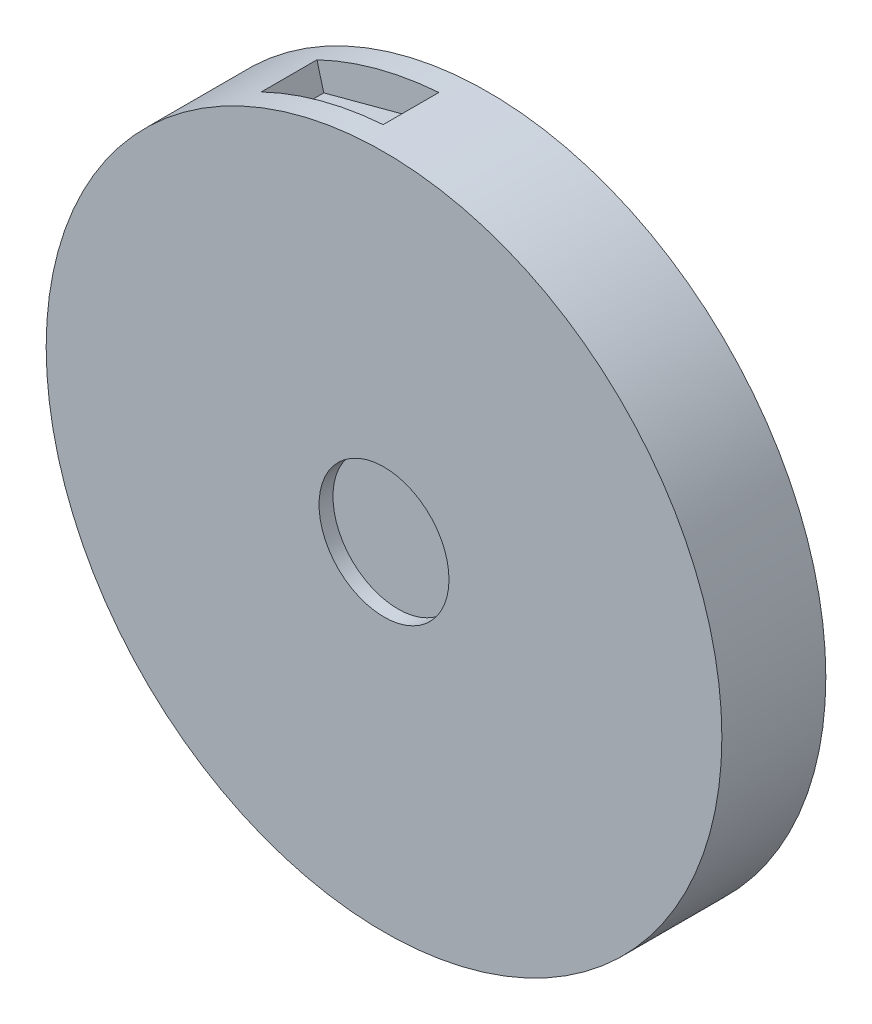
ISO-10303-21;
HEADER;
FILE_DESCRIPTION(('STEP AP214'),'2;1');
FILE_NAME('part.step','',(''),(''),'','','');
FILE_SCHEMA(('AUTOMOTIVE_DESIGN { 1 0 10303 214 1 1 1 1 }'));
ENDSEC;
DATA;
#1=APPLICATION_CONTEXT('core data for automotive mechanical design processes');
#2=APPLICATION_PROTOCOL_DEFINITION('international standard','automotive_design',2000,#1);
#3=PRODUCT_CONTEXT('',#1,'mechanical');
#4=PRODUCT('Part','Part','',(#3));
#5=PRODUCT_RELATED_PRODUCT_CATEGORY('part','',(#4));
#6=PRODUCT_DEFINITION_FORMATION('','',#4);
#7=PRODUCT_DEFINITION_CONTEXT('part definition',#1,'design');
#8=PRODUCT_DEFINITION('design','',#6,#7);
#9=PRODUCT_DEFINITION_SHAPE('','',#8);
#10=(LENGTH_UNIT() NAMED_UNIT(*) SI_UNIT(.MILLI.,.METRE.));
#11=(NAMED_UNIT(*) PLANE_ANGLE_UNIT() SI_UNIT($,.RADIAN.));
#12=(NAMED_UNIT(*) SI_UNIT($,.STERADIAN.) SOLID_ANGLE_UNIT());
#13=UNCERTAINTY_MEASURE_WITH_UNIT(LENGTH_MEASURE(1.E-05),#10,'distance_accuracy_value','');
#14=(GEOMETRIC_REPRESENTATION_CONTEXT(3) GLOBAL_UNCERTAINTY_ASSIGNED_CONTEXT((#13)) GLOBAL_UNIT_ASSIGNED_CONTEXT((#10,
#11,#12)) REPRESENTATION_CONTEXT('',''));
#15=CARTESIAN_POINT('',(0.,0.,0.));
#16=DIRECTION('',(0.,0.,1.));
#17=DIRECTION('',(1.,0.,0.));
#18=AXIS2_PLACEMENT_3D('',#15,#16,#17);
#19=CARTESIAN_POINT('',(0.,0.,5.6));
#20=DIRECTION('',(0.,0.,-1.));
#21=DIRECTION('',(-1.,0.,0.));
#22=AXIS2_PLACEMENT_3D('',#19,#20,#21);
#23=CYLINDRICAL_SURFACE('',#22,18.2);
#24=CARTESIAN_POINT('',(0.,0.,0.));
#25=DIRECTION('',(0.,0.,1.));
#26=DIRECTION('',(1.,0.,0.));
#27=AXIS2_PLACEMENT_3D('',#24,#25,#26);
#28=CIRCLE('',#27,18.2);
#29=CARTESIAN_POINT('',(18.2,0.,0.));
#30=VERTEX_POINT('',#29);
#31=EDGE_CURVE('E42',#30,#30,#28,.T.);
#32=ORIENTED_EDGE('',*,*,#31,.T.);
#33=EDGE_LOOP('',(#32));
#34=FACE_BOUND('',#33,.T.);
#35=CARTESIAN_POINT('',(0.,0.,5.6));
#36=DIRECTION('',(0.,0.,1.));
#37=DIRECTION('',(1.,0.,0.));
#38=AXIS2_PLACEMENT_3D('',#35,#36,#37);
#39=CIRCLE('',#38,18.2);
#40=CARTESIAN_POINT('',(18.2,0.,5.6));
#41=VERTEX_POINT('',#40);
#42=EDGE_CURVE('E11',#41,#41,#39,.T.);
#43=ORIENTED_EDGE('',*,*,#42,.F.);
#44=EDGE_LOOP('',(#43));
#45=FACE_BOUND('',#44,.T.);
#46=CARTESIAN_POINT('',(0.,0.,4.3));
#47=DIRECTION('',(0.,0.,-1.));
#48=DIRECTION('',(-1.,0.,0.));
#49=AXIS2_PLACEMENT_3D('',#46,#47,#48);
#50=CIRCLE('',#49,18.2);
#51=CARTESIAN_POINT('',(-1.34343249344233,18.150349559597,4.3));
#52=VERTEX_POINT('',#51);
#53=CARTESIAN_POINT('',(-7.91172811220799,16.3903800528999,4.3));
#54=VERTEX_POINT('',#53);
#55=EDGE_CURVE('E164',#52,#54,#50,.F.);
#56=ORIENTED_EDGE('',*,*,#55,.T.);
#57=DIRECTION('',(0.,0.,-1.));
#58=VECTOR('',#57,1.);
#59=CARTESIAN_POINT('',(-7.91172811220799,16.3903800528999,5.6));
#60=LINE('',#59,#58);
#61=CARTESIAN_POINT('',(-7.91172811220799,16.3903800528999,1.3));
#62=VERTEX_POINT('',#61);
#63=EDGE_CURVE('E150',#54,#62,#60,.T.);
#64=ORIENTED_EDGE('',*,*,#63,.T.);
#65=CARTESIAN_POINT('',(0.,0.,1.3));
#66=DIRECTION('',(0.,0.,1.));
#67=DIRECTION('',(1.,0.,0.));
#68=AXIS2_PLACEMENT_3D('',#65,#66,#67);
#69=CIRCLE('',#68,18.2);
#70=CARTESIAN_POINT('',(-1.34343249344233,18.150349559597,1.3));
#71=VERTEX_POINT('',#70);
#72=EDGE_CURVE('E175',#62,#71,#69,.F.);
#73=ORIENTED_EDGE('',*,*,#72,.T.);
#74=DIRECTION('',(0.,0.,-1.));
#75=VECTOR('',#74,1.);
#76=CARTESIAN_POINT('',(-1.34343249344233,18.150349559597,5.6));
#77=LINE('',#76,#75);
#78=EDGE_CURVE('E171',#71,#52,#77,.F.);
#79=ORIENTED_EDGE('',*,*,#78,.T.);
#80=EDGE_LOOP('',(#56,#64,#73,#79));
#81=FACE_BOUND('',#80,.T.);
#82=ADVANCED_FACE('F39',(#34,#45,#81),#23,.T.);
#83=CARTESIAN_POINT('',(0.,0.,0.));
#84=DIRECTION('',(0.,0.,1.));
#85=DIRECTION('',(1.,0.,0.));
#86=AXIS2_PLACEMENT_3D('',#83,#84,#85);
#87=PLANE('',#86);
#88=CARTESIAN_POINT('',(-13.7080078236947,-11.3000096261424,0.));
#89=DIRECTION('',(0.,0.,-1.));
#90=DIRECTION('',(1.,0.,0.));
#91=AXIS2_PLACEMENT_3D('',#88,#89,#90);
#92=CIRCLE('',#91,0.749999999999999);
#93=CARTESIAN_POINT('',(-13.8232715037505,-10.5589196963363,0.));
#94=VERTEX_POINT('',#93);
#95=CARTESIAN_POINT('',(-13.0025271502126,-11.5545622127394,0.));
#96=VERTEX_POINT('',#95);
#97=EDGE_CURVE('E211',#94,#96,#92,.T.);
#98=ORIENTED_EDGE('',*,*,#97,.F.);
#99=CARTESIAN_POINT('',(-13.8540084850988,-10.3612957150547,0.));
#100=DIRECTION('',(0.,0.,1.));
#101=DIRECTION('',(-1.,0.,0.));
#102=AXIS2_PLACEMENT_3D('',#99,#100,#101);
#103=CIRCLE('',#102,0.2);
#104=CARTESIAN_POINT('',(-14.0141704329034,-10.4810794805467,0.));
#105=VERTEX_POINT('',#104);
#106=EDGE_CURVE('E62',#105,#94,#103,.T.);
#107=ORIENTED_EDGE('',*,*,#106,.F.);
#108=CARTESIAN_POINT('',(0.,0.,0.));
#109=DIRECTION('',(0.,0.,-1.));
#110=DIRECTION('',(-1.,0.,0.));
#111=AXIS2_PLACEMENT_3D('',#108,#109,#110);
#112=CIRCLE('',#111,17.5);
#113=CARTESIAN_POINT('',(-12.9625423113181,-11.7568064042616,0.));
#114=VERTEX_POINT('',#113);
#115=EDGE_CURVE('E200',#114,#105,#112,.T.);
#116=ORIENTED_EDGE('',*,*,#115,.F.);
#117=CARTESIAN_POINT('',(-12.8143989706174,-11.6224429024986,0.));
#118=DIRECTION('',(0.,0.,1.));
#119=DIRECTION('',(1.,0.,0.));
#120=AXIS2_PLACEMENT_3D('',#117,#118,#119);
#121=CIRCLE('',#120,0.199999999999999);
#122=EDGE_CURVE('E214',#96,#114,#121,.T.);
#123=ORIENTED_EDGE('',*,*,#122,.F.);
#124=EDGE_LOOP('',(#98,#107,#116,#123));
#125=FACE_BOUND('',#124,.T.);
#126=CARTESIAN_POINT('',(11.4493785932638,-13.8892068702141,0.));
#127=DIRECTION('',(0.,0.,-1.));
#128=DIRECTION('',(1.,0.,0.));
#129=AXIS2_PLACEMENT_3D('',#126,#127,#128);
#130=CIRCLE('',#129,2.);
#131=CARTESIAN_POINT('',(9.5429332328363,-14.4937447827593,0.));
#132=VERTEX_POINT('',#131);
#133=CARTESIAN_POINT('',(12.4065763656063,-12.1331395524206,0.));
#134=VERTEX_POINT('',#133);
#135=EDGE_CURVE('E274',#132,#134,#130,.T.);
#136=ORIENTED_EDGE('',*,*,#135,.F.);
#137=CARTESIAN_POINT('',(9.35228869679355,-14.5541985740139,0.));
#138=DIRECTION('',(0.,0.,1.));
#139=DIRECTION('',(-1.,0.,0.));
#140=AXIS2_PLACEMENT_3D('',#137,#138,#139);
#141=CIRCLE('',#140,0.199999999999996);
#142=CARTESIAN_POINT('',(9.46040764126515,-14.7224552049273,0.));
#143=VERTEX_POINT('',#142);
#144=EDGE_CURVE('E252',#143,#132,#141,.T.);
#145=ORIENTED_EDGE('',*,*,#144,.F.);
#146=CARTESIAN_POINT('',(0.,0.,0.));
#147=DIRECTION('',(0.,0.,-1.));
#148=DIRECTION('',(-1.,0.,0.));
#149=AXIS2_PLACEMENT_3D('',#146,#147,#148);
#150=CIRCLE('',#149,17.5);
#151=CARTESIAN_POINT('',(12.6468313583647,-12.0957701942903,0.));
#152=VERTEX_POINT('',#151);
#153=EDGE_CURVE('E263',#152,#143,#150,.T.);
#154=ORIENTED_EDGE('',*,*,#153,.F.);
#155=CARTESIAN_POINT('',(12.5022961428406,-11.9575328206413,0.));
#156=DIRECTION('',(0.,0.,1.));
#157=DIRECTION('',(1.,0.,0.));
#158=AXIS2_PLACEMENT_3D('',#155,#156,#157);
#159=CIRCLE('',#158,0.199999999999996);
#160=EDGE_CURVE('E277',#134,#152,#159,.T.);
#161=ORIENTED_EDGE('',*,*,#160,.F.);
#162=EDGE_LOOP('',(#136,#145,#154,#161));
#163=FACE_BOUND('',#162,.T.);
#164=ORIENTED_EDGE('',*,*,#31,.F.);
#165=EDGE_LOOP('',(#164));
#166=FACE_BOUND('',#165,.T.);
#167=CARTESIAN_POINT('',(-12.5022961428406,11.9575328206413,0.));
#168=DIRECTION('',(0.,0.,1.));
#169=DIRECTION('',(1.,0.,0.));
#170=AXIS2_PLACEMENT_3D('',#167,#168,#169);
#171=CIRCLE('',#170,0.199999999999996);
#172=CARTESIAN_POINT('',(-12.4065763656063,12.1331395524206,0.));
#173=VERTEX_POINT('',#172);
#174=CARTESIAN_POINT('',(-12.6468313583648,12.0957701942903,0.));
#175=VERTEX_POINT('',#174);
#176=EDGE_CURVE('E242',#173,#175,#171,.T.);
#177=ORIENTED_EDGE('',*,*,#176,.F.);
#178=CARTESIAN_POINT('',(-11.4493785932638,13.8892068702141,0.));
#179=DIRECTION('',(0.,0.,-1.));
#180=DIRECTION('',(-1.,0.,0.));
#181=AXIS2_PLACEMENT_3D('',#178,#179,#180);
#182=CIRCLE('',#181,2.);
#183=CARTESIAN_POINT('',(-9.5429332328363,14.4937447827593,0.));
#184=VERTEX_POINT('',#183);
#185=EDGE_CURVE('E221',#184,#173,#182,.T.);
#186=ORIENTED_EDGE('',*,*,#185,.F.);
#187=CARTESIAN_POINT('',(-9.35228869679356,14.5541985740139,0.));
#188=DIRECTION('',(0.,0.,1.));
#189=DIRECTION('',(-1.,0.,0.));
#190=AXIS2_PLACEMENT_3D('',#187,#188,#189);
#191=CIRCLE('',#190,0.199999999999994);
#192=CARTESIAN_POINT('',(-9.46040764126515,14.7224552049273,0.));
#193=VERTEX_POINT('',#192);
#194=EDGE_CURVE('E231',#193,#184,#191,.T.);
#195=ORIENTED_EDGE('',*,*,#194,.F.);
#196=CARTESIAN_POINT('',(0.,0.,0.));
#197=DIRECTION('',(0.,0.,-1.));
#198=DIRECTION('',(-1.,0.,0.));
#199=AXIS2_PLACEMENT_3D('',#196,#197,#198);
#200=CIRCLE('',#199,17.5);
#201=EDGE_CURVE('E245',#175,#193,#200,.T.);
#202=ORIENTED_EDGE('',*,*,#201,.F.);
#203=EDGE_LOOP('',(#177,#186,#195,#202));
#204=FACE_BOUND('',#203,.T.);
#205=ADVANCED_FACE('F298',(#125,#163,#166,#204),#87,.F.);
#206=CARTESIAN_POINT('',(0.,0.,5.6));
#207=DIRECTION('',(0.,0.,1.));
#208=DIRECTION('',(1.,0.,0.));
#209=AXIS2_PLACEMENT_3D('',#206,#207,#208);
#210=PLANE('',#209);
#211=CARTESIAN_POINT('',(0.,0.,5.6));
#212=DIRECTION('',(0.,0.,1.));
#213=DIRECTION('',(1.,0.,0.));
#214=AXIS2_PLACEMENT_3D('',#211,#212,#213);
#215=CIRCLE('',#214,3.5);
#216=CARTESIAN_POINT('',(3.5,0.,5.6));
#217=VERTEX_POINT('',#216);
#218=EDGE_CURVE('E158',#217,#217,#215,.T.);
#219=ORIENTED_EDGE('',*,*,#218,.F.);
#220=EDGE_LOOP('',(#219));
#221=FACE_BOUND('',#220,.T.);
#222=ORIENTED_EDGE('',*,*,#42,.T.);
#223=EDGE_LOOP('',(#222));
#224=FACE_BOUND('',#223,.T.);
#225=ADVANCED_FACE('F317',(#221,#224),#210,.T.);
#226=CARTESIAN_POINT('',(9.35228869679355,-14.5541985740139,4.));
#227=DIRECTION('',(0.,0.,-1.));
#228=DIRECTION('',(-1.,0.,0.));
#229=AXIS2_PLACEMENT_3D('',#226,#227,#228);
#230=CYLINDRICAL_SURFACE('',#229,0.199999999999996);
#231=ORIENTED_EDGE('',*,*,#144,.T.);
#232=DIRECTION('',(0.,0.,-1.));
#233=VECTOR('',#232,1.);
#234=CARTESIAN_POINT('',(9.5429332328363,-14.4937447827593,4.));
#235=LINE('',#234,#233);
#236=CARTESIAN_POINT('',(9.5429332328363,-14.4937447827593,4.));
#237=VERTEX_POINT('',#236);
#238=EDGE_CURVE('E272',#237,#132,#235,.T.);
#239=ORIENTED_EDGE('',*,*,#238,.F.);
#240=CARTESIAN_POINT('',(9.35228869679355,-14.5541985740139,4.));
#241=DIRECTION('',(0.,0.,1.));
#242=DIRECTION('',(-1.,0.,0.));
#243=AXIS2_PLACEMENT_3D('',#240,#241,#242);
#244=CIRCLE('',#243,0.199999999999996);
#245=CARTESIAN_POINT('',(9.46040764126515,-14.7224552049273,4.));
#246=VERTEX_POINT('',#245);
#247=EDGE_CURVE('E259',#246,#237,#244,.T.);
#248=ORIENTED_EDGE('',*,*,#247,.F.);
#249=DIRECTION('',(0.,0.,-1.));
#250=VECTOR('',#249,1.);
#251=CARTESIAN_POINT('',(9.46040764126515,-14.7224552049273,4.));
#252=LINE('',#251,#250);
#253=EDGE_CURVE('E282',#246,#143,#252,.T.);
#254=ORIENTED_EDGE('',*,*,#253,.T.);
#255=EDGE_LOOP('',(#231,#239,#248,#254));
#256=FACE_BOUND('',#255,.T.);
#257=ADVANCED_FACE('F307',(#256),#230,.T.);
#258=CARTESIAN_POINT('',(0.,0.,4.));
#259=DIRECTION('',(0.,0.,-1.));
#260=DIRECTION('',(-1.,0.,0.));
#261=AXIS2_PLACEMENT_3D('',#258,#259,#260);
#262=CYLINDRICAL_SURFACE('',#261,17.5);
#263=ORIENTED_EDGE('',*,*,#153,.T.);
#264=ORIENTED_EDGE('',*,*,#253,.F.);
#265=CARTESIAN_POINT('',(0.,0.,4.));
#266=DIRECTION('',(0.,0.,-1.));
#267=DIRECTION('',(-1.,0.,0.));
#268=AXIS2_PLACEMENT_3D('',#265,#266,#267);
#269=CIRCLE('',#268,17.5);
#270=CARTESIAN_POINT('',(12.6468313583647,-12.0957701942903,4.));
#271=VERTEX_POINT('',#270);
#272=EDGE_CURVE('E269',#271,#246,#269,.T.);
#273=ORIENTED_EDGE('',*,*,#272,.F.);
#274=DIRECTION('',(0.,0.,-1.));
#275=VECTOR('',#274,1.);
#276=CARTESIAN_POINT('',(12.6468313583647,-12.0957701942903,4.));
#277=LINE('',#276,#275);
#278=EDGE_CURVE('E284',#271,#152,#277,.T.);
#279=ORIENTED_EDGE('',*,*,#278,.T.);
#280=EDGE_LOOP('',(#263,#264,#273,#279));
#281=FACE_BOUND('',#280,.T.);
#282=ADVANCED_FACE('F309',(#281),#262,.F.);
#283=CARTESIAN_POINT('',(12.5022961428406,-11.9575328206413,4.));
#284=DIRECTION('',(0.,0.,-1.));
#285=DIRECTION('',(-1.,0.,0.));
#286=AXIS2_PLACEMENT_3D('',#283,#284,#285);
#287=CYLINDRICAL_SURFACE('',#286,0.199999999999996);
#288=ORIENTED_EDGE('',*,*,#160,.T.);
#289=ORIENTED_EDGE('',*,*,#278,.F.);
#290=CARTESIAN_POINT('',(12.5022961428406,-11.9575328206413,4.));
#291=DIRECTION('',(0.,0.,1.));
#292=DIRECTION('',(1.,0.,0.));
#293=AXIS2_PLACEMENT_3D('',#290,#291,#292);
#294=CIRCLE('',#293,0.199999999999996);
#295=CARTESIAN_POINT('',(12.4065763656063,-12.1331395524206,4.));
#296=VERTEX_POINT('',#295);
#297=EDGE_CURVE('E266',#296,#271,#294,.T.);
#298=ORIENTED_EDGE('',*,*,#297,.F.);
#299=DIRECTION('',(0.,0.,-1.));
#300=VECTOR('',#299,1.);
#301=CARTESIAN_POINT('',(12.4065763656063,-12.1331395524206,4.));
#302=LINE('',#301,#300);
#303=EDGE_CURVE('E286',#296,#134,#302,.T.);
#304=ORIENTED_EDGE('',*,*,#303,.T.);
#305=EDGE_LOOP('',(#288,#289,#298,#304));
#306=FACE_BOUND('',#305,.T.);
#307=ADVANCED_FACE('F302',(#306),#287,.T.);
#308=CARTESIAN_POINT('',(11.4493785932638,-13.8892068702141,4.));
#309=DIRECTION('',(0.,0.,-1.));
#310=DIRECTION('',(-1.,0.,0.));
#311=AXIS2_PLACEMENT_3D('',#308,#309,#310);
#312=CYLINDRICAL_SURFACE('',#311,2.);
#313=ORIENTED_EDGE('',*,*,#135,.T.);
#314=ORIENTED_EDGE('',*,*,#303,.F.);
#315=CARTESIAN_POINT('',(11.4493785932638,-13.8892068702141,4.));
#316=DIRECTION('',(0.,0.,-1.));
#317=DIRECTION('',(1.,0.,0.));
#318=AXIS2_PLACEMENT_3D('',#315,#316,#317);
#319=CIRCLE('',#318,2.);
#320=EDGE_CURVE('E262',#237,#296,#319,.T.);
#321=ORIENTED_EDGE('',*,*,#320,.F.);
#322=ORIENTED_EDGE('',*,*,#238,.T.);
#323=EDGE_LOOP('',(#313,#314,#321,#322));
#324=FACE_BOUND('',#323,.T.);
#325=ADVANCED_FACE('F292',(#324),#312,.F.);
#326=CARTESIAN_POINT('',(4.67614434839678,-7.27709928700693,4.));
#327=DIRECTION('',(0.,0.,-1.));
#328=DIRECTION('',(-1.,0.,0.));
#329=AXIS2_PLACEMENT_3D('',#326,#327,#328);
#330=PLANE('',#329);
#331=ORIENTED_EDGE('',*,*,#247,.T.);
#332=ORIENTED_EDGE('',*,*,#320,.T.);
#333=ORIENTED_EDGE('',*,*,#297,.T.);
#334=ORIENTED_EDGE('',*,*,#272,.T.);
#335=EDGE_LOOP('',(#331,#332,#333,#334));
#336=FACE_BOUND('',#335,.T.);
#337=ADVANCED_FACE('F306',(#336),#330,.T.);
#338=CARTESIAN_POINT('',(-11.4493785932638,13.8892068702141,4.));
#339=DIRECTION('',(0.,0.,-1.));
#340=DIRECTION('',(-1.,0.,0.));
#341=AXIS2_PLACEMENT_3D('',#338,#339,#340);
#342=CYLINDRICAL_SURFACE('',#341,2.);
#343=ORIENTED_EDGE('',*,*,#185,.T.);
#344=DIRECTION('',(0.,0.,-1.));
#345=VECTOR('',#344,1.);
#346=CARTESIAN_POINT('',(-12.4065763656063,12.1331395524206,4.));
#347=LINE('',#346,#345);
#348=CARTESIAN_POINT('',(-12.4065763656063,12.1331395524206,4.));
#349=VERTEX_POINT('',#348);
#350=EDGE_CURVE('E240',#349,#173,#347,.T.);
#351=ORIENTED_EDGE('',*,*,#350,.F.);
#352=CARTESIAN_POINT('',(-11.4493785932638,13.8892068702141,4.));
#353=DIRECTION('',(0.,0.,-1.));
#354=DIRECTION('',(-1.,0.,0.));
#355=AXIS2_PLACEMENT_3D('',#352,#353,#354);
#356=CIRCLE('',#355,2.);
#357=CARTESIAN_POINT('',(-9.5429332328363,14.4937447827593,4.));
#358=VERTEX_POINT('',#357);
#359=EDGE_CURVE('E227',#358,#349,#356,.T.);
#360=ORIENTED_EDGE('',*,*,#359,.F.);
#361=DIRECTION('',(0.,0.,-1.));
#362=VECTOR('',#361,1.);
#363=CARTESIAN_POINT('',(-9.5429332328363,14.4937447827593,4.));
#364=LINE('',#363,#362);
#365=EDGE_CURVE('E250',#358,#184,#364,.T.);
#366=ORIENTED_EDGE('',*,*,#365,.T.);
#367=EDGE_LOOP('',(#343,#351,#360,#366));
#368=FACE_BOUND('',#367,.T.);
#369=ADVANCED_FACE('F342',(#368),#342,.F.);
#370=CARTESIAN_POINT('',(-9.35228869679356,14.5541985740139,4.));
#371=DIRECTION('',(0.,0.,-1.));
#372=DIRECTION('',(-1.,0.,0.));
#373=AXIS2_PLACEMENT_3D('',#370,#371,#372);
#374=CYLINDRICAL_SURFACE('',#373,0.199999999999994);
#375=ORIENTED_EDGE('',*,*,#194,.T.);
#376=ORIENTED_EDGE('',*,*,#365,.F.);
#377=CARTESIAN_POINT('',(-9.35228869679356,14.5541985740139,4.));
#378=DIRECTION('',(0.,0.,1.));
#379=DIRECTION('',(-1.,0.,0.));
#380=AXIS2_PLACEMENT_3D('',#377,#378,#379);
#381=CIRCLE('',#380,0.199999999999994);
#382=CARTESIAN_POINT('',(-9.46040764126515,14.7224552049273,4.));
#383=VERTEX_POINT('',#382);
#384=EDGE_CURVE('E237',#383,#358,#381,.T.);
#385=ORIENTED_EDGE('',*,*,#384,.F.);
#386=DIRECTION('',(0.,0.,-1.));
#387=VECTOR('',#386,1.);
#388=CARTESIAN_POINT('',(-9.46040764126515,14.7224552049273,4.));
#389=LINE('',#388,#387);
#390=EDGE_CURVE('E253',#383,#193,#389,.T.);
#391=ORIENTED_EDGE('',*,*,#390,.T.);
#392=EDGE_LOOP('',(#375,#376,#385,#391));
#393=FACE_BOUND('',#392,.T.);
#394=ADVANCED_FACE('F346',(#393),#374,.T.);
#395=CARTESIAN_POINT('',(0.,0.,4.));
#396=DIRECTION('',(0.,0.,-1.));
#397=DIRECTION('',(-1.,0.,0.));
#398=AXIS2_PLACEMENT_3D('',#395,#396,#397);
#399=CYLINDRICAL_SURFACE('',#398,17.5);
#400=ORIENTED_EDGE('',*,*,#201,.T.);
#401=ORIENTED_EDGE('',*,*,#390,.F.);
#402=CARTESIAN_POINT('',(0.,0.,4.));
#403=DIRECTION('',(0.,0.,-1.));
#404=DIRECTION('',(-1.,0.,0.));
#405=AXIS2_PLACEMENT_3D('',#402,#403,#404);
#406=CIRCLE('',#405,17.5);
#407=CARTESIAN_POINT('',(-12.6468313583648,12.0957701942903,4.));
#408=VERTEX_POINT('',#407);
#409=EDGE_CURVE('E234',#408,#383,#406,.T.);
#410=ORIENTED_EDGE('',*,*,#409,.F.);
#411=DIRECTION('',(0.,0.,-1.));
#412=VECTOR('',#411,1.);
#413=CARTESIAN_POINT('',(-12.6468313583648,12.0957701942903,4.));
#414=LINE('',#413,#412);
#415=EDGE_CURVE('E255',#408,#175,#414,.T.);
#416=ORIENTED_EDGE('',*,*,#415,.T.);
#417=EDGE_LOOP('',(#400,#401,#410,#416));
#418=FACE_BOUND('',#417,.T.);
#419=ADVANCED_FACE('F354',(#418),#399,.F.);
#420=CARTESIAN_POINT('',(-12.5022961428406,11.9575328206413,4.));
#421=DIRECTION('',(0.,0.,-1.));
#422=DIRECTION('',(-1.,0.,0.));
#423=AXIS2_PLACEMENT_3D('',#420,#421,#422);
#424=CYLINDRICAL_SURFACE('',#423,0.199999999999996);
#425=ORIENTED_EDGE('',*,*,#176,.T.);
#426=ORIENTED_EDGE('',*,*,#415,.F.);
#427=CARTESIAN_POINT('',(-12.5022961428406,11.9575328206413,4.));
#428=DIRECTION('',(0.,0.,1.));
#429=DIRECTION('',(1.,0.,0.));
#430=AXIS2_PLACEMENT_3D('',#427,#428,#429);
#431=CIRCLE('',#430,0.199999999999996);
#432=EDGE_CURVE('E230',#349,#408,#431,.T.);
#433=ORIENTED_EDGE('',*,*,#432,.F.);
#434=ORIENTED_EDGE('',*,*,#350,.T.);
#435=EDGE_LOOP('',(#425,#426,#433,#434));
#436=FACE_BOUND('',#435,.T.);
#437=ADVANCED_FACE('F350',(#436),#424,.T.);
#438=CARTESIAN_POINT('',(-11.9758373680522,12.9233698454277,4.));
#439=DIRECTION('',(0.,0.,-1.));
#440=DIRECTION('',(-1.,0.,0.));
#441=AXIS2_PLACEMENT_3D('',#438,#439,#440);
#442=PLANE('',#441);
#443=ORIENTED_EDGE('',*,*,#359,.T.);
#444=ORIENTED_EDGE('',*,*,#432,.T.);
#445=ORIENTED_EDGE('',*,*,#409,.T.);
#446=ORIENTED_EDGE('',*,*,#384,.T.);
#447=EDGE_LOOP('',(#443,#444,#445,#446));
#448=FACE_BOUND('',#447,.T.);
#449=ADVANCED_FACE('F353',(#448),#442,.T.);
#450=CARTESIAN_POINT('',(-13.8540084850988,-10.3612957150547,4.));
#451=DIRECTION('',(0.,0.,-1.));
#452=DIRECTION('',(-1.,0.,0.));
#453=AXIS2_PLACEMENT_3D('',#450,#451,#452);
#454=CYLINDRICAL_SURFACE('',#453,0.2);
#455=ORIENTED_EDGE('',*,*,#106,.T.);
#456=DIRECTION('',(0.,0.,-1.));
#457=VECTOR('',#456,1.);
#458=CARTESIAN_POINT('',(-13.8232715037505,-10.5589196963363,4.));
#459=LINE('',#458,#457);
#460=CARTESIAN_POINT('',(-13.8232715037505,-10.5589196963363,4.));
#461=VERTEX_POINT('',#460);
#462=EDGE_CURVE('E209',#461,#94,#459,.T.);
#463=ORIENTED_EDGE('',*,*,#462,.F.);
#464=CARTESIAN_POINT('',(-13.8540084850988,-10.3612957150547,4.));
#465=DIRECTION('',(0.,0.,1.));
#466=DIRECTION('',(-1.,0.,0.));
#467=AXIS2_PLACEMENT_3D('',#464,#465,#466);
#468=CIRCLE('',#467,0.2);
#469=CARTESIAN_POINT('',(-14.0141704329034,-10.4810794805467,4.));
#470=VERTEX_POINT('',#469);
#471=EDGE_CURVE('E196',#470,#461,#468,.T.);
#472=ORIENTED_EDGE('',*,*,#471,.F.);
#473=DIRECTION('',(0.,0.,-1.));
#474=VECTOR('',#473,1.);
#475=CARTESIAN_POINT('',(-14.0141704329034,-10.4810794805467,4.));
#476=LINE('',#475,#474);
#477=EDGE_CURVE('E219',#470,#105,#476,.T.);
#478=ORIENTED_EDGE('',*,*,#477,.T.);
#479=EDGE_LOOP('',(#455,#463,#472,#478));
#480=FACE_BOUND('',#479,.T.);
#481=ADVANCED_FACE('F364',(#480),#454,.T.);
#482=CARTESIAN_POINT('',(0.,0.,4.));
#483=DIRECTION('',(0.,0.,-1.));
#484=DIRECTION('',(-1.,0.,0.));
#485=AXIS2_PLACEMENT_3D('',#482,#483,#484);
#486=CYLINDRICAL_SURFACE('',#485,17.5);
#487=ORIENTED_EDGE('',*,*,#115,.T.);
#488=ORIENTED_EDGE('',*,*,#477,.F.);
#489=CARTESIAN_POINT('',(0.,0.,4.));
#490=DIRECTION('',(0.,0.,-1.));
#491=DIRECTION('',(-1.,0.,0.));
#492=AXIS2_PLACEMENT_3D('',#489,#490,#491);
#493=CIRCLE('',#492,17.5);
#494=CARTESIAN_POINT('',(-12.9625423113181,-11.7568064042616,4.));
#495=VERTEX_POINT('',#494);
#496=EDGE_CURVE('E206',#495,#470,#493,.T.);
#497=ORIENTED_EDGE('',*,*,#496,.F.);
#498=DIRECTION('',(0.,0.,-1.));
#499=VECTOR('',#498,1.);
#500=CARTESIAN_POINT('',(-12.9625423113181,-11.7568064042616,4.));
#501=LINE('',#500,#499);
#502=EDGE_CURVE('E222',#495,#114,#501,.T.);
#503=ORIENTED_EDGE('',*,*,#502,.T.);
#504=EDGE_LOOP('',(#487,#488,#497,#503));
#505=FACE_BOUND('',#504,.T.);
#506=ADVANCED_FACE('F368',(#505),#486,.F.);
#507=CARTESIAN_POINT('',(-12.8143989706174,-11.6224429024986,4.));
#508=DIRECTION('',(0.,0.,-1.));
#509=DIRECTION('',(-1.,0.,0.));
#510=AXIS2_PLACEMENT_3D('',#507,#508,#509);
#511=CYLINDRICAL_SURFACE('',#510,0.199999999999999);
#512=ORIENTED_EDGE('',*,*,#122,.T.);
#513=ORIENTED_EDGE('',*,*,#502,.F.);
#514=CARTESIAN_POINT('',(-12.8143989706174,-11.6224429024986,4.));
#515=DIRECTION('',(0.,0.,1.));
#516=DIRECTION('',(1.,0.,0.));
#517=AXIS2_PLACEMENT_3D('',#514,#515,#516);
#518=CIRCLE('',#517,0.199999999999999);
#519=CARTESIAN_POINT('',(-13.0025271502126,-11.5545622127394,4.));
#520=VERTEX_POINT('',#519);
#521=EDGE_CURVE('E203',#520,#495,#518,.T.);
#522=ORIENTED_EDGE('',*,*,#521,.F.);
#523=DIRECTION('',(0.,0.,-1.));
#524=VECTOR('',#523,1.);
#525=CARTESIAN_POINT('',(-13.0025271502126,-11.5545622127394,4.));
#526=LINE('',#525,#524);
#527=EDGE_CURVE('E224',#520,#96,#526,.T.);
#528=ORIENTED_EDGE('',*,*,#527,.T.);
#529=EDGE_LOOP('',(#512,#513,#522,#528));
#530=FACE_BOUND('',#529,.T.);
#531=ADVANCED_FACE('F373',(#530),#511,.T.);
#532=CARTESIAN_POINT('',(-13.7080078236947,-11.3000096261424,4.));
#533=DIRECTION('',(0.,0.,-1.));
#534=DIRECTION('',(-1.,0.,0.));
#535=AXIS2_PLACEMENT_3D('',#532,#533,#534);
#536=CYLINDRICAL_SURFACE('',#535,0.749999999999999);
#537=ORIENTED_EDGE('',*,*,#97,.T.);
#538=ORIENTED_EDGE('',*,*,#527,.F.);
#539=CARTESIAN_POINT('',(-13.7080078236947,-11.3000096261424,4.));
#540=DIRECTION('',(0.,0.,-1.));
#541=DIRECTION('',(1.,0.,0.));
#542=AXIS2_PLACEMENT_3D('',#539,#540,#541);
#543=CIRCLE('',#542,0.749999999999999);
#544=EDGE_CURVE('E199',#461,#520,#543,.T.);
#545=ORIENTED_EDGE('',*,*,#544,.F.);
#546=ORIENTED_EDGE('',*,*,#462,.T.);
#547=EDGE_LOOP('',(#537,#538,#545,#546));
#548=FACE_BOUND('',#547,.T.);
#549=ADVANCED_FACE('F369',(#548),#536,.F.);
#550=CARTESIAN_POINT('',(-6.92700424254938,-5.18064785752735,4.));
#551=DIRECTION('',(0.,0.,-1.));
#552=DIRECTION('',(-1.,0.,0.));
#553=AXIS2_PLACEMENT_3D('',#550,#551,#552);
#554=PLANE('',#553);
#555=ORIENTED_EDGE('',*,*,#471,.T.);
#556=ORIENTED_EDGE('',*,*,#544,.T.);
#557=ORIENTED_EDGE('',*,*,#521,.T.);
#558=ORIENTED_EDGE('',*,*,#496,.T.);
#559=EDGE_LOOP('',(#555,#556,#557,#558));
#560=FACE_BOUND('',#559,.T.);
#561=ADVANCED_FACE('F372',(#560),#554,.T.);
#562=CARTESIAN_POINT('',(0.,0.,4.85));
#563=DIRECTION('',(0.,0.,1.));
#564=DIRECTION('',(1.,0.,0.));
#565=AXIS2_PLACEMENT_3D('',#562,#563,#564);
#566=CYLINDRICAL_SURFACE('',#565,3.5);
#567=CARTESIAN_POINT('',(0.,0.,4.85));
#568=DIRECTION('',(0.,0.,1.));
#569=DIRECTION('',(1.,0.,0.));
#570=AXIS2_PLACEMENT_3D('',#567,#568,#569);
#571=CIRCLE('',#570,3.5);
#572=CARTESIAN_POINT('',(3.5,0.,4.85));
#573=VERTEX_POINT('',#572);
#574=EDGE_CURVE('E189',#573,#573,#571,.T.);
#575=ORIENTED_EDGE('',*,*,#574,.F.);
#576=EDGE_LOOP('',(#575));
#577=FACE_BOUND('',#576,.T.);
#578=ORIENTED_EDGE('',*,*,#218,.T.);
#579=EDGE_LOOP('',(#578));
#580=FACE_BOUND('',#579,.T.);
#581=ADVANCED_FACE('F383',(#577,#580),#566,.F.);
#582=CARTESIAN_POINT('',(0.,0.,4.85));
#583=DIRECTION('',(0.,0.,1.));
#584=DIRECTION('',(1.,0.,0.));
#585=AXIS2_PLACEMENT_3D('',#582,#583,#584);
#586=PLANE('',#585);
#587=ORIENTED_EDGE('',*,*,#574,.T.);
#588=EDGE_LOOP('',(#587));
#589=FACE_BOUND('',#588,.T.);
#590=ADVANCED_FACE('F387',(#589),#586,.T.);
#591=CARTESIAN_POINT('',(-9.05363362224256,20.6520294337917,4.3));
#592=DIRECTION('',(0.,0.,-1.));
#593=DIRECTION('',(-1.,0.,0.));
#594=AXIS2_PLACEMENT_3D('',#591,#592,#593);
#595=PLANE('',#594);
#596=DIRECTION('',(0.258819045102521,-0.965925826289068,0.));
#597=VECTOR('',#596,1.);
#598=CARTESIAN_POINT('',(-2.4853380034769,22.4119989404889,4.3));
#599=LINE('',#598,#597);
#600=CARTESIAN_POINT('',(-0.978601863455694,16.7887831123295,4.3));
#601=VERTEX_POINT('',#600);
#602=EDGE_CURVE('E159',#52,#601,#599,.T.);
#603=ORIENTED_EDGE('',*,*,#602,.T.);
#604=DIRECTION('',(0.965925826289068,0.258819045102521,0.));
#605=VECTOR('',#604,1.);
#606=CARTESIAN_POINT('',(-7.54689748222136,15.0288136056324,4.3));
#607=LINE('',#606,#605);
#608=CARTESIAN_POINT('',(-7.54689748222136,15.0288136056324,4.3));
#609=VERTEX_POINT('',#608);
#610=EDGE_CURVE('E167',#609,#601,#607,.T.);
#611=ORIENTED_EDGE('',*,*,#610,.F.);
#612=DIRECTION('',(0.258819045102521,-0.965925826289068,0.));
#613=VECTOR('',#612,1.);
#614=CARTESIAN_POINT('',(-9.05363362224256,20.6520294337917,4.3));
#615=LINE('',#614,#613);
#616=EDGE_CURVE('E153',#54,#609,#615,.T.);
#617=ORIENTED_EDGE('',*,*,#616,.F.);
#618=ORIENTED_EDGE('',*,*,#55,.F.);
#619=EDGE_LOOP('',(#603,#611,#617,#618));
#620=FACE_BOUND('',#619,.T.);
#621=ADVANCED_FACE('F163',(#620),#595,.T.);
#622=CARTESIAN_POINT('',(-2.4853380034769,22.4119989404889,4.3));
#623=DIRECTION('',(-0.965925826289068,-0.258819045102521,0.));
#624=DIRECTION('',(0.258819045102521,-0.965925826289068,0.));
#625=AXIS2_PLACEMENT_3D('',#622,#623,#624);
#626=PLANE('',#625);
#627=DIRECTION('',(0.258819045102521,-0.965925826289068,0.));
#628=VECTOR('',#627,1.);
#629=CARTESIAN_POINT('',(-2.4853380034769,22.4119989404889,1.3));
#630=LINE('',#629,#628);
#631=CARTESIAN_POINT('',(-0.978601863455694,16.7887831123295,1.3));
#632=VERTEX_POINT('',#631);
#633=EDGE_CURVE('E186',#71,#632,#630,.T.);
#634=ORIENTED_EDGE('',*,*,#633,.T.);
#635=DIRECTION('',(0.,0.,-1.));
#636=VECTOR('',#635,1.);
#637=CARTESIAN_POINT('',(-0.978601863455694,16.7887831123295,4.3));
#638=LINE('',#637,#636);
#639=EDGE_CURVE('E173',#601,#632,#638,.T.);
#640=ORIENTED_EDGE('',*,*,#639,.F.);
#641=ORIENTED_EDGE('',*,*,#602,.F.);
#642=ORIENTED_EDGE('',*,*,#78,.F.);
#643=EDGE_LOOP('',(#634,#640,#641,#642));
#644=FACE_BOUND('',#643,.T.);
#645=ADVANCED_FACE('F394',(#644),#626,.T.);
#646=CARTESIAN_POINT('',(-9.05363362224256,20.6520294337917,1.3));
#647=DIRECTION('',(0.,0.,1.));
#648=DIRECTION('',(1.,0.,0.));
#649=AXIS2_PLACEMENT_3D('',#646,#647,#648);
#650=PLANE('',#649);
#651=DIRECTION('',(0.258819045102521,-0.965925826289068,0.));
#652=VECTOR('',#651,1.);
#653=CARTESIAN_POINT('',(-9.05363362224256,20.6520294337917,1.3));
#654=LINE('',#653,#652);
#655=CARTESIAN_POINT('',(-7.54689748222136,15.0288136056324,1.3));
#656=VERTEX_POINT('',#655);
#657=EDGE_CURVE('E54',#62,#656,#654,.T.);
#658=ORIENTED_EDGE('',*,*,#657,.T.);
#659=DIRECTION('',(-0.965925826289068,-0.258819045102521,0.));
#660=VECTOR('',#659,1.);
#661=CARTESIAN_POINT('',(-7.54689748222136,15.0288136056324,1.3));
#662=LINE('',#661,#660);
#663=EDGE_CURVE('E181',#632,#656,#662,.T.);
#664=ORIENTED_EDGE('',*,*,#663,.F.);
#665=ORIENTED_EDGE('',*,*,#633,.F.);
#666=ORIENTED_EDGE('',*,*,#72,.F.);
#667=EDGE_LOOP('',(#658,#664,#665,#666));
#668=FACE_BOUND('',#667,.T.);
#669=ADVANCED_FACE('F397',(#668),#650,.T.);
#670=CARTESIAN_POINT('',(-9.05363362224256,20.6520294337917,4.3));
#671=DIRECTION('',(0.965925826289068,0.258819045102521,0.));
#672=DIRECTION('',(-0.258819045102521,0.965925826289068,0.));
#673=AXIS2_PLACEMENT_3D('',#670,#671,#672);
#674=PLANE('',#673);
#675=ORIENTED_EDGE('',*,*,#616,.T.);
#676=DIRECTION('',(0.,0.,1.));
#677=VECTOR('',#676,1.);
#678=CARTESIAN_POINT('',(-7.54689748222136,15.0288136056324,4.3));
#679=LINE('',#678,#677);
#680=EDGE_CURVE('E168',#656,#609,#679,.T.);
#681=ORIENTED_EDGE('',*,*,#680,.F.);
#682=ORIENTED_EDGE('',*,*,#657,.F.);
#683=ORIENTED_EDGE('',*,*,#63,.F.);
#684=EDGE_LOOP('',(#675,#681,#682,#683));
#685=FACE_BOUND('',#684,.T.);
#686=ADVANCED_FACE('F152',(#685),#674,.T.);
#687=CARTESIAN_POINT('',(-4.26274967283853,15.908798358981,0.));
#688=DIRECTION('',(-0.258819045102521,0.965925826289068,0.));
#689=DIRECTION('',(-0.965925826289068,-0.258819045102521,0.));
#690=AXIS2_PLACEMENT_3D('',#687,#688,#689);
#691=PLANE('',#690);
#692=ORIENTED_EDGE('',*,*,#610,.T.);
#693=ORIENTED_EDGE('',*,*,#639,.T.);
#694=ORIENTED_EDGE('',*,*,#663,.T.);
#695=ORIENTED_EDGE('',*,*,#680,.T.);
#696=EDGE_LOOP('',(#692,#693,#694,#695));
#697=FACE_BOUND('',#696,.T.);
#698=ADVANCED_FACE('F404',(#697),#691,.T.);
#699=CLOSED_SHELL('',(#82,#205,#225,#257,#282,#307,#325,#337,#369,#394,#419,#437,#449,#481,#506,
#531,#549,#561,#581,#590,#621,#645,#669,#686,#698));
#700=MANIFOLD_SOLID_BREP('B2',#699);
#701=ADVANCED_BREP_SHAPE_REPRESENTATION('',(#18,#700),#14);
#702=SHAPE_DEFINITION_REPRESENTATION(#9,#701);
ENDSEC;
END-ISO-10303-21;
